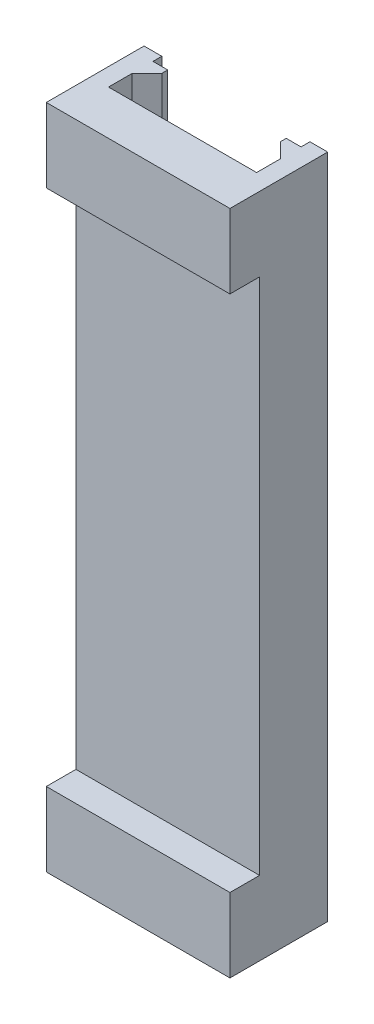
ISO-10303-21;
HEADER;
FILE_DESCRIPTION(('STEP AP214'),'2;1');
FILE_NAME('part.step','',(''),(''),'','','');
FILE_SCHEMA(('AUTOMOTIVE_DESIGN { 1 0 10303 214 1 1 1 1 }'));
ENDSEC;
DATA;
#1=APPLICATION_CONTEXT('core data for automotive mechanical design processes');
#2=APPLICATION_PROTOCOL_DEFINITION('international standard','automotive_design',2000,#1);
#3=PRODUCT_CONTEXT('',#1,'mechanical');
#4=PRODUCT('Part','Part','',(#3));
#5=PRODUCT_RELATED_PRODUCT_CATEGORY('part','',(#4));
#6=PRODUCT_DEFINITION_FORMATION('','',#4);
#7=PRODUCT_DEFINITION_CONTEXT('part definition',#1,'design');
#8=PRODUCT_DEFINITION('design','',#6,#7);
#9=PRODUCT_DEFINITION_SHAPE('','',#8);
#10=(LENGTH_UNIT() NAMED_UNIT(*) SI_UNIT(.MILLI.,.METRE.));
#11=(NAMED_UNIT(*) PLANE_ANGLE_UNIT() SI_UNIT($,.RADIAN.));
#12=(NAMED_UNIT(*) SI_UNIT($,.STERADIAN.) SOLID_ANGLE_UNIT());
#13=UNCERTAINTY_MEASURE_WITH_UNIT(LENGTH_MEASURE(1.E-05),#10,'distance_accuracy_value','');
#14=(GEOMETRIC_REPRESENTATION_CONTEXT(3) GLOBAL_UNCERTAINTY_ASSIGNED_CONTEXT((#13)) GLOBAL_UNIT_ASSIGNED_CONTEXT((#10,
#11,#12)) REPRESENTATION_CONTEXT('',''));
#15=CARTESIAN_POINT('',(0.,0.,0.));
#16=DIRECTION('',(0.,0.,1.));
#17=DIRECTION('',(1.,0.,0.));
#18=AXIS2_PLACEMENT_3D('',#15,#16,#17);
#19=CARTESIAN_POINT('',(-6.2,45.,1.));
#20=DIRECTION('',(0.,0.,-1.));
#21=DIRECTION('',(-1.,0.,0.));
#22=AXIS2_PLACEMENT_3D('',#19,#20,#21);
#23=PLANE('',#22);
#24=DIRECTION('',(-1.,0.,0.));
#25=VECTOR('',#24,1.);
#26=CARTESIAN_POINT('',(-6.2,5.,1.));
#27=LINE('',#26,#25);
#28=CARTESIAN_POINT('',(6.20000000000001,5.00000000000001,1.));
#29=VERTEX_POINT('',#28);
#30=CARTESIAN_POINT('',(-6.2,5.00000000000001,1.));
#31=VERTEX_POINT('',#30);
#32=EDGE_CURVE('E56',#29,#31,#27,.T.);
#33=ORIENTED_EDGE('',*,*,#32,.F.);
#34=DIRECTION('',(0.,-1.,0.));
#35=VECTOR('',#34,1.);
#36=CARTESIAN_POINT('',(6.20000000000001,45.,1.));
#37=LINE('',#36,#35);
#38=CARTESIAN_POINT('',(6.20000000000001,40.,1.));
#39=VERTEX_POINT('',#38);
#40=EDGE_CURVE('E306',#39,#29,#37,.T.);
#41=ORIENTED_EDGE('',*,*,#40,.F.);
#42=DIRECTION('',(1.,0.,0.));
#43=VECTOR('',#42,1.);
#44=CARTESIAN_POINT('',(-6.2,40.,1.));
#45=LINE('',#44,#43);
#46=CARTESIAN_POINT('',(-6.2,40.,1.));
#47=VERTEX_POINT('',#46);
#48=EDGE_CURVE('E197',#47,#39,#45,.T.);
#49=ORIENTED_EDGE('',*,*,#48,.F.);
#50=DIRECTION('',(0.,-1.,0.));
#51=VECTOR('',#50,1.);
#52=CARTESIAN_POINT('',(-6.2,45.,1.));
#53=LINE('',#52,#51);
#54=EDGE_CURVE('E52',#47,#31,#53,.T.);
#55=ORIENTED_EDGE('',*,*,#54,.T.);
#56=EDGE_LOOP('',(#33,#41,#49,#55));
#57=FACE_BOUND('',#56,.T.);
#58=ADVANCED_FACE('F37',(#57),#23,.F.);
#59=CARTESIAN_POINT('',(-5.,45.,0.));
#60=DIRECTION('',(-1.,0.,0.));
#61=DIRECTION('',(0.,0.,1.));
#62=AXIS2_PLACEMENT_3D('',#59,#60,#61);
#63=PLANE('',#62);
#64=DIRECTION('',(0.,0.,-1.));
#65=VECTOR('',#64,1.);
#66=CARTESIAN_POINT('',(-5.,0.,0.));
#67=LINE('',#66,#65);
#68=CARTESIAN_POINT('',(-5.,0.,0.));
#69=VERTEX_POINT('',#68);
#70=CARTESIAN_POINT('',(-5.,0.,-1.6));
#71=VERTEX_POINT('',#70);
#72=EDGE_CURVE('E221',#69,#71,#67,.T.);
#73=ORIENTED_EDGE('',*,*,#72,.T.);
#74=DIRECTION('',(0.,-1.,0.));
#75=VECTOR('',#74,1.);
#76=CARTESIAN_POINT('',(-5.,45.,-1.6));
#77=LINE('',#76,#75);
#78=CARTESIAN_POINT('',(-5.,45.,-1.6));
#79=VERTEX_POINT('',#78);
#80=EDGE_CURVE('E11',#79,#71,#77,.T.);
#81=ORIENTED_EDGE('',*,*,#80,.F.);
#82=DIRECTION('',(0.,0.,-1.));
#83=VECTOR('',#82,1.);
#84=CARTESIAN_POINT('',(-5.,45.,0.));
#85=LINE('',#84,#83);
#86=CARTESIAN_POINT('',(-5.,45.,0.));
#87=VERTEX_POINT('',#86);
#88=EDGE_CURVE('E222',#87,#79,#85,.T.);
#89=ORIENTED_EDGE('',*,*,#88,.F.);
#90=DIRECTION('',(0.,-1.,0.));
#91=VECTOR('',#90,1.);
#92=CARTESIAN_POINT('',(-5.,45.,0.));
#93=LINE('',#92,#91);
#94=EDGE_CURVE('E254',#87,#69,#93,.T.);
#95=ORIENTED_EDGE('',*,*,#94,.T.);
#96=EDGE_LOOP('',(#73,#81,#89,#95));
#97=FACE_BOUND('',#96,.T.);
#98=ADVANCED_FACE('F39',(#97),#63,.F.);
#99=CARTESIAN_POINT('',(-5.,45.,-1.6));
#100=DIRECTION('',(-0.707106781186547,0.,-0.707106781186547));
#101=DIRECTION('',(-0.707106781186548,0.,0.707106781186547));
#102=AXIS2_PLACEMENT_3D('',#99,#100,#101);
#103=PLANE('',#102);
#104=DIRECTION('',(0.707106781186548,0.,-0.707106781186548));
#105=VECTOR('',#104,1.);
#106=CARTESIAN_POINT('',(-5.,0.,-1.6));
#107=LINE('',#106,#105);
#108=CARTESIAN_POINT('',(-4.,0.,-2.6));
#109=VERTEX_POINT('',#108);
#110=EDGE_CURVE('E257',#71,#109,#107,.T.);
#111=ORIENTED_EDGE('',*,*,#110,.T.);
#112=DIRECTION('',(0.,-1.,0.));
#113=VECTOR('',#112,1.);
#114=CARTESIAN_POINT('',(-4.,45.,-2.6));
#115=LINE('',#114,#113);
#116=CARTESIAN_POINT('',(-4.,45.,-2.6));
#117=VERTEX_POINT('',#116);
#118=EDGE_CURVE('E45',#117,#109,#115,.T.);
#119=ORIENTED_EDGE('',*,*,#118,.F.);
#120=DIRECTION('',(0.707106781186548,0.,-0.707106781186548));
#121=VECTOR('',#120,1.);
#122=CARTESIAN_POINT('',(-5.,45.,-1.6));
#123=LINE('',#122,#121);
#124=EDGE_CURVE('E225',#79,#117,#123,.T.);
#125=ORIENTED_EDGE('',*,*,#124,.F.);
#126=ORIENTED_EDGE('',*,*,#80,.T.);
#127=EDGE_LOOP('',(#111,#119,#125,#126));
#128=FACE_BOUND('',#127,.T.);
#129=ADVANCED_FACE('F347',(#128),#103,.F.);
#130=CARTESIAN_POINT('',(-4.,45.,-2.6));
#131=DIRECTION('',(-1.,0.,0.));
#132=DIRECTION('',(0.,0.,1.));
#133=AXIS2_PLACEMENT_3D('',#130,#131,#132);
#134=PLANE('',#133);
#135=DIRECTION('',(0.,0.,-1.));
#136=VECTOR('',#135,1.);
#137=CARTESIAN_POINT('',(-4.,0.,-2.6));
#138=LINE('',#137,#136);
#139=CARTESIAN_POINT('',(-4.,0.,-3.));
#140=VERTEX_POINT('',#139);
#141=EDGE_CURVE('E259',#109,#140,#138,.T.);
#142=ORIENTED_EDGE('',*,*,#141,.T.);
#143=DIRECTION('',(0.,-1.,0.));
#144=VECTOR('',#143,1.);
#145=CARTESIAN_POINT('',(-4.,45.,-3.));
#146=LINE('',#145,#144);
#147=CARTESIAN_POINT('',(-4.,45.,-3.));
#148=VERTEX_POINT('',#147);
#149=EDGE_CURVE('E317',#148,#140,#146,.T.);
#150=ORIENTED_EDGE('',*,*,#149,.F.);
#151=DIRECTION('',(0.,0.,-1.));
#152=VECTOR('',#151,1.);
#153=CARTESIAN_POINT('',(-4.,45.,-2.6));
#154=LINE('',#153,#152);
#155=EDGE_CURVE('E228',#117,#148,#154,.T.);
#156=ORIENTED_EDGE('',*,*,#155,.F.);
#157=ORIENTED_EDGE('',*,*,#118,.T.);
#158=EDGE_LOOP('',(#142,#150,#156,#157));
#159=FACE_BOUND('',#158,.T.);
#160=ADVANCED_FACE('F324',(#159),#134,.F.);
#161=CARTESIAN_POINT('',(-4.,45.,-3.));
#162=DIRECTION('',(0.,0.,1.));
#163=DIRECTION('',(1.,0.,0.));
#164=AXIS2_PLACEMENT_3D('',#161,#162,#163);
#165=PLANE('',#164);
#166=DIRECTION('',(-1.,0.,0.));
#167=VECTOR('',#166,1.);
#168=CARTESIAN_POINT('',(-4.,0.,-3.));
#169=LINE('',#168,#167);
#170=CARTESIAN_POINT('',(-5.,0.,-3.));
#171=VERTEX_POINT('',#170);
#172=EDGE_CURVE('E261',#140,#171,#169,.T.);
#173=ORIENTED_EDGE('',*,*,#172,.T.);
#174=DIRECTION('',(0.,-1.,0.));
#175=VECTOR('',#174,1.);
#176=CARTESIAN_POINT('',(-5.,45.,-3.));
#177=LINE('',#176,#175);
#178=CARTESIAN_POINT('',(-5.,45.,-3.));
#179=VERTEX_POINT('',#178);
#180=EDGE_CURVE('E314',#179,#171,#177,.T.);
#181=ORIENTED_EDGE('',*,*,#180,.F.);
#182=DIRECTION('',(-1.,0.,0.));
#183=VECTOR('',#182,1.);
#184=CARTESIAN_POINT('',(-4.,45.,-3.));
#185=LINE('',#184,#183);
#186=EDGE_CURVE('E230',#148,#179,#185,.T.);
#187=ORIENTED_EDGE('',*,*,#186,.F.);
#188=ORIENTED_EDGE('',*,*,#149,.T.);
#189=EDGE_LOOP('',(#173,#181,#187,#188));
#190=FACE_BOUND('',#189,.T.);
#191=ADVANCED_FACE('F335',(#190),#165,.F.);
#192=CARTESIAN_POINT('',(-5.,45.,-3.));
#193=DIRECTION('',(-1.,0.,0.));
#194=DIRECTION('',(0.,0.,1.));
#195=AXIS2_PLACEMENT_3D('',#192,#193,#194);
#196=PLANE('',#195);
#197=DIRECTION('',(0.,0.,-1.));
#198=VECTOR('',#197,1.);
#199=CARTESIAN_POINT('',(-5.,0.,-3.));
#200=LINE('',#199,#198);
#201=CARTESIAN_POINT('',(-5.,0.,-3.6));
#202=VERTEX_POINT('',#201);
#203=EDGE_CURVE('E263',#171,#202,#200,.T.);
#204=ORIENTED_EDGE('',*,*,#203,.T.);
#205=DIRECTION('',(0.,-1.,0.));
#206=VECTOR('',#205,1.);
#207=CARTESIAN_POINT('',(-5.,45.,-3.6));
#208=LINE('',#207,#206);
#209=CARTESIAN_POINT('',(-5.,45.,-3.6));
#210=VERTEX_POINT('',#209);
#211=EDGE_CURVE('E311',#210,#202,#208,.T.);
#212=ORIENTED_EDGE('',*,*,#211,.F.);
#213=DIRECTION('',(0.,0.,-1.));
#214=VECTOR('',#213,1.);
#215=CARTESIAN_POINT('',(-5.,45.,-3.));
#216=LINE('',#215,#214);
#217=EDGE_CURVE('E232',#179,#210,#216,.T.);
#218=ORIENTED_EDGE('',*,*,#217,.F.);
#219=ORIENTED_EDGE('',*,*,#180,.T.);
#220=EDGE_LOOP('',(#204,#212,#218,#219));
#221=FACE_BOUND('',#220,.T.);
#222=ADVANCED_FACE('F339',(#221),#196,.F.);
#223=CARTESIAN_POINT('',(-5.,45.,-3.6));
#224=DIRECTION('',(0.,0.,1.));
#225=DIRECTION('',(1.,0.,0.));
#226=AXIS2_PLACEMENT_3D('',#223,#224,#225);
#227=PLANE('',#226);
#228=DIRECTION('',(-1.,0.,0.));
#229=VECTOR('',#228,1.);
#230=CARTESIAN_POINT('',(-5.,0.,-3.6));
#231=LINE('',#230,#229);
#232=CARTESIAN_POINT('',(-6.2,0.,-3.6));
#233=VERTEX_POINT('',#232);
#234=EDGE_CURVE('E265',#202,#233,#231,.T.);
#235=ORIENTED_EDGE('',*,*,#234,.T.);
#236=DIRECTION('',(0.,-1.,0.));
#237=VECTOR('',#236,1.);
#238=CARTESIAN_POINT('',(-6.2,45.,-3.6));
#239=LINE('',#238,#237);
#240=CARTESIAN_POINT('',(-6.2,45.,-3.6));
#241=VERTEX_POINT('',#240);
#242=EDGE_CURVE('E309',#241,#233,#239,.T.);
#243=ORIENTED_EDGE('',*,*,#242,.F.);
#244=DIRECTION('',(-1.,0.,0.));
#245=VECTOR('',#244,1.);
#246=CARTESIAN_POINT('',(-5.,45.,-3.6));
#247=LINE('',#246,#245);
#248=EDGE_CURVE('E234',#210,#241,#247,.T.);
#249=ORIENTED_EDGE('',*,*,#248,.F.);
#250=ORIENTED_EDGE('',*,*,#211,.T.);
#251=EDGE_LOOP('',(#235,#243,#249,#250));
#252=FACE_BOUND('',#251,.T.);
#253=ADVANCED_FACE('F417',(#252),#227,.F.);
#254=CARTESIAN_POINT('',(-6.2,45.,-3.6));
#255=DIRECTION('',(1.,0.,0.));
#256=DIRECTION('',(0.,0.,-1.));
#257=AXIS2_PLACEMENT_3D('',#254,#255,#256);
#258=PLANE('',#257);
#259=DIRECTION('',(0.,0.,1.));
#260=VECTOR('',#259,1.);
#261=CARTESIAN_POINT('',(-6.2,0.,-3.6));
#262=LINE('',#261,#260);
#263=CARTESIAN_POINT('',(-6.2,0.,3.));
#264=VERTEX_POINT('',#263);
#265=EDGE_CURVE('E193',#233,#264,#262,.T.);
#266=ORIENTED_EDGE('',*,*,#265,.T.);
#267=DIRECTION('',(0.,-1.,0.));
#268=VECTOR('',#267,1.);
#269=CARTESIAN_POINT('',(-6.2,0.,3.));
#270=LINE('',#269,#268);
#271=CARTESIAN_POINT('',(-6.2,5.,3.));
#272=VERTEX_POINT('',#271);
#273=EDGE_CURVE('E177',#272,#264,#270,.T.);
#274=ORIENTED_EDGE('',*,*,#273,.F.);
#275=DIRECTION('',(0.,0.,-1.));
#276=VECTOR('',#275,1.);
#277=CARTESIAN_POINT('',(-6.2,5.,3.));
#278=LINE('',#277,#276);
#279=EDGE_CURVE('E183',#272,#31,#278,.T.);
#280=ORIENTED_EDGE('',*,*,#279,.T.);
#281=ORIENTED_EDGE('',*,*,#54,.F.);
#282=DIRECTION('',(0.,0.,-1.));
#283=VECTOR('',#282,1.);
#284=CARTESIAN_POINT('',(-6.2,40.,3.));
#285=LINE('',#284,#283);
#286=CARTESIAN_POINT('',(-6.2,40.,3.));
#287=VERTEX_POINT('',#286);
#288=EDGE_CURVE('E218',#287,#47,#285,.T.);
#289=ORIENTED_EDGE('',*,*,#288,.F.);
#290=DIRECTION('',(0.,-1.,0.));
#291=VECTOR('',#290,1.);
#292=CARTESIAN_POINT('',(-6.2,45.,3.));
#293=LINE('',#292,#291);
#294=CARTESIAN_POINT('',(-6.2,45.,3.));
#295=VERTEX_POINT('',#294);
#296=EDGE_CURVE('E202',#295,#287,#293,.T.);
#297=ORIENTED_EDGE('',*,*,#296,.F.);
#298=DIRECTION('',(0.,0.,1.));
#299=VECTOR('',#298,1.);
#300=CARTESIAN_POINT('',(-6.2,45.,-3.6));
#301=LINE('',#300,#299);
#302=EDGE_CURVE('E236',#241,#295,#301,.T.);
#303=ORIENTED_EDGE('',*,*,#302,.F.);
#304=ORIENTED_EDGE('',*,*,#242,.T.);
#305=EDGE_LOOP('',(#266,#274,#280,#281,#289,#297,#303,#304));
#306=FACE_BOUND('',#305,.T.);
#307=ADVANCED_FACE('F190',(#306),#258,.F.);
#308=CARTESIAN_POINT('',(6.2,45.,-3.6));
#309=DIRECTION('',(-1.,0.,0.));
#310=DIRECTION('',(0.,0.,1.));
#311=AXIS2_PLACEMENT_3D('',#308,#309,#310);
#312=PLANE('',#311);
#313=DIRECTION('',(0.,0.,-1.));
#314=VECTOR('',#313,1.);
#315=CARTESIAN_POINT('',(6.2,0.,-3.6));
#316=LINE('',#315,#314);
#317=CARTESIAN_POINT('',(6.20000000000001,0.,3.));
#318=VERTEX_POINT('',#317);
#319=CARTESIAN_POINT('',(6.2,0.,-3.6));
#320=VERTEX_POINT('',#319);
#321=EDGE_CURVE('E268',#318,#320,#316,.T.);
#322=ORIENTED_EDGE('',*,*,#321,.T.);
#323=DIRECTION('',(0.,-1.,0.));
#324=VECTOR('',#323,1.);
#325=CARTESIAN_POINT('',(6.2,45.,-3.6));
#326=LINE('',#325,#324);
#327=CARTESIAN_POINT('',(6.2,45.,-3.6));
#328=VERTEX_POINT('',#327);
#329=EDGE_CURVE('E303',#328,#320,#326,.T.);
#330=ORIENTED_EDGE('',*,*,#329,.F.);
#331=DIRECTION('',(0.,0.,-1.));
#332=VECTOR('',#331,1.);
#333=CARTESIAN_POINT('',(6.2,45.,-3.6));
#334=LINE('',#333,#332);
#335=CARTESIAN_POINT('',(6.20000000000001,45.,3.));
#336=VERTEX_POINT('',#335);
#337=EDGE_CURVE('E238',#336,#328,#334,.T.);
#338=ORIENTED_EDGE('',*,*,#337,.F.);
#339=DIRECTION('',(0.,1.,0.));
#340=VECTOR('',#339,1.);
#341=CARTESIAN_POINT('',(6.20000000000001,45.,3.));
#342=LINE('',#341,#340);
#343=CARTESIAN_POINT('',(6.20000000000001,40.,3.));
#344=VERTEX_POINT('',#343);
#345=EDGE_CURVE('E207',#344,#336,#342,.T.);
#346=ORIENTED_EDGE('',*,*,#345,.F.);
#347=DIRECTION('',(0.,0.,-1.));
#348=VECTOR('',#347,1.);
#349=CARTESIAN_POINT('',(6.20000000000001,40.,3.));
#350=LINE('',#349,#348);
#351=EDGE_CURVE('E213',#344,#39,#350,.T.);
#352=ORIENTED_EDGE('',*,*,#351,.T.);
#353=ORIENTED_EDGE('',*,*,#40,.T.);
#354=DIRECTION('',(0.,0.,-1.));
#355=VECTOR('',#354,1.);
#356=CARTESIAN_POINT('',(6.20000000000001,5.,3.));
#357=LINE('',#356,#355);
#358=CARTESIAN_POINT('',(6.20000000000001,5.,3.));
#359=VERTEX_POINT('',#358);
#360=EDGE_CURVE('E188',#359,#29,#357,.T.);
#361=ORIENTED_EDGE('',*,*,#360,.F.);
#362=DIRECTION('',(0.,1.,0.));
#363=VECTOR('',#362,1.);
#364=CARTESIAN_POINT('',(6.20000000000001,0.,3.));
#365=LINE('',#364,#363);
#366=EDGE_CURVE('E179',#318,#359,#365,.T.);
#367=ORIENTED_EDGE('',*,*,#366,.F.);
#368=EDGE_LOOP('',(#322,#330,#338,#346,#352,#353,#361,#367));
#369=FACE_BOUND('',#368,.T.);
#370=ADVANCED_FACE('F386',(#369),#312,.F.);
#371=CARTESIAN_POINT('',(5.,45.,-3.6));
#372=DIRECTION('',(0.,0.,1.));
#373=DIRECTION('',(1.,0.,0.));
#374=AXIS2_PLACEMENT_3D('',#371,#372,#373);
#375=PLANE('',#374);
#376=DIRECTION('',(-1.,0.,0.));
#377=VECTOR('',#376,1.);
#378=CARTESIAN_POINT('',(5.,0.,-3.6));
#379=LINE('',#378,#377);
#380=CARTESIAN_POINT('',(5.,0.,-3.6));
#381=VERTEX_POINT('',#380);
#382=EDGE_CURVE('E270',#320,#381,#379,.T.);
#383=ORIENTED_EDGE('',*,*,#382,.T.);
#384=DIRECTION('',(0.,-1.,0.));
#385=VECTOR('',#384,1.);
#386=CARTESIAN_POINT('',(5.,45.,-3.6));
#387=LINE('',#386,#385);
#388=CARTESIAN_POINT('',(5.,45.,-3.6));
#389=VERTEX_POINT('',#388);
#390=EDGE_CURVE('E300',#389,#381,#387,.T.);
#391=ORIENTED_EDGE('',*,*,#390,.F.);
#392=DIRECTION('',(-1.,0.,0.));
#393=VECTOR('',#392,1.);
#394=CARTESIAN_POINT('',(5.,45.,-3.6));
#395=LINE('',#394,#393);
#396=EDGE_CURVE('E240',#328,#389,#395,.T.);
#397=ORIENTED_EDGE('',*,*,#396,.F.);
#398=ORIENTED_EDGE('',*,*,#329,.T.);
#399=EDGE_LOOP('',(#383,#391,#397,#398));
#400=FACE_BOUND('',#399,.T.);
#401=ADVANCED_FACE('F382',(#400),#375,.F.);
#402=CARTESIAN_POINT('',(5.,45.,-3.));
#403=DIRECTION('',(1.,0.,0.));
#404=DIRECTION('',(0.,0.,-1.));
#405=AXIS2_PLACEMENT_3D('',#402,#403,#404);
#406=PLANE('',#405);
#407=DIRECTION('',(0.,0.,1.));
#408=VECTOR('',#407,1.);
#409=CARTESIAN_POINT('',(5.,0.,-3.));
#410=LINE('',#409,#408);
#411=CARTESIAN_POINT('',(5.,0.,-3.));
#412=VERTEX_POINT('',#411);
#413=EDGE_CURVE('E272',#381,#412,#410,.T.);
#414=ORIENTED_EDGE('',*,*,#413,.T.);
#415=DIRECTION('',(0.,-1.,0.));
#416=VECTOR('',#415,1.);
#417=CARTESIAN_POINT('',(5.,45.,-3.));
#418=LINE('',#417,#416);
#419=CARTESIAN_POINT('',(5.,45.,-3.));
#420=VERTEX_POINT('',#419);
#421=EDGE_CURVE('E297',#420,#412,#418,.T.);
#422=ORIENTED_EDGE('',*,*,#421,.F.);
#423=DIRECTION('',(0.,0.,1.));
#424=VECTOR('',#423,1.);
#425=CARTESIAN_POINT('',(5.,45.,-3.));
#426=LINE('',#425,#424);
#427=EDGE_CURVE('E242',#389,#420,#426,.T.);
#428=ORIENTED_EDGE('',*,*,#427,.F.);
#429=ORIENTED_EDGE('',*,*,#390,.T.);
#430=EDGE_LOOP('',(#414,#422,#428,#429));
#431=FACE_BOUND('',#430,.T.);
#432=ADVANCED_FACE('F378',(#431),#406,.F.);
#433=CARTESIAN_POINT('',(4.,45.,-3.));
#434=DIRECTION('',(0.,0.,1.));
#435=DIRECTION('',(1.,0.,0.));
#436=AXIS2_PLACEMENT_3D('',#433,#434,#435);
#437=PLANE('',#436);
#438=DIRECTION('',(-1.,0.,0.));
#439=VECTOR('',#438,1.);
#440=CARTESIAN_POINT('',(4.,0.,-3.));
#441=LINE('',#440,#439);
#442=CARTESIAN_POINT('',(4.,0.,-3.));
#443=VERTEX_POINT('',#442);
#444=EDGE_CURVE('E274',#412,#443,#441,.T.);
#445=ORIENTED_EDGE('',*,*,#444,.T.);
#446=DIRECTION('',(0.,-1.,0.));
#447=VECTOR('',#446,1.);
#448=CARTESIAN_POINT('',(4.,45.,-3.));
#449=LINE('',#448,#447);
#450=CARTESIAN_POINT('',(4.,45.,-3.));
#451=VERTEX_POINT('',#450);
#452=EDGE_CURVE('E294',#451,#443,#449,.T.);
#453=ORIENTED_EDGE('',*,*,#452,.F.);
#454=DIRECTION('',(-1.,0.,0.));
#455=VECTOR('',#454,1.);
#456=CARTESIAN_POINT('',(4.,45.,-3.));
#457=LINE('',#456,#455);
#458=EDGE_CURVE('E244',#420,#451,#457,.T.);
#459=ORIENTED_EDGE('',*,*,#458,.F.);
#460=ORIENTED_EDGE('',*,*,#421,.T.);
#461=EDGE_LOOP('',(#445,#453,#459,#460));
#462=FACE_BOUND('',#461,.T.);
#463=ADVANCED_FACE('F374',(#462),#437,.F.);
#464=CARTESIAN_POINT('',(4.,45.,-2.6));
#465=DIRECTION('',(1.,0.,0.));
#466=DIRECTION('',(0.,0.,-1.));
#467=AXIS2_PLACEMENT_3D('',#464,#465,#466);
#468=PLANE('',#467);
#469=DIRECTION('',(0.,0.,1.));
#470=VECTOR('',#469,1.);
#471=CARTESIAN_POINT('',(4.,0.,-2.6));
#472=LINE('',#471,#470);
#473=CARTESIAN_POINT('',(4.,0.,-2.6));
#474=VERTEX_POINT('',#473);
#475=EDGE_CURVE('E276',#443,#474,#472,.T.);
#476=ORIENTED_EDGE('',*,*,#475,.T.);
#477=DIRECTION('',(0.,-1.,0.));
#478=VECTOR('',#477,1.);
#479=CARTESIAN_POINT('',(4.,45.,-2.6));
#480=LINE('',#479,#478);
#481=CARTESIAN_POINT('',(4.,45.,-2.6));
#482=VERTEX_POINT('',#481);
#483=EDGE_CURVE('E291',#482,#474,#480,.T.);
#484=ORIENTED_EDGE('',*,*,#483,.F.);
#485=DIRECTION('',(0.,0.,1.));
#486=VECTOR('',#485,1.);
#487=CARTESIAN_POINT('',(4.,45.,-2.6));
#488=LINE('',#487,#486);
#489=EDGE_CURVE('E246',#451,#482,#488,.T.);
#490=ORIENTED_EDGE('',*,*,#489,.F.);
#491=ORIENTED_EDGE('',*,*,#452,.T.);
#492=EDGE_LOOP('',(#476,#484,#490,#491));
#493=FACE_BOUND('',#492,.T.);
#494=ADVANCED_FACE('F369',(#493),#468,.F.);
#495=CARTESIAN_POINT('',(5.,45.,-1.6));
#496=DIRECTION('',(0.707106781186547,0.,-0.707106781186547));
#497=DIRECTION('',(-0.707106781186548,0.,-0.707106781186547));
#498=AXIS2_PLACEMENT_3D('',#495,#496,#497);
#499=PLANE('',#498);
#500=DIRECTION('',(0.707106781186548,0.,0.707106781186548));
#501=VECTOR('',#500,1.);
#502=CARTESIAN_POINT('',(5.,0.,-1.6));
#503=LINE('',#502,#501);
#504=CARTESIAN_POINT('',(5.,0.,-1.6));
#505=VERTEX_POINT('',#504);
#506=EDGE_CURVE('E278',#474,#505,#503,.T.);
#507=ORIENTED_EDGE('',*,*,#506,.T.);
#508=DIRECTION('',(0.,-1.,0.));
#509=VECTOR('',#508,1.);
#510=CARTESIAN_POINT('',(5.,45.,-1.6));
#511=LINE('',#510,#509);
#512=CARTESIAN_POINT('',(5.,45.,-1.6));
#513=VERTEX_POINT('',#512);
#514=EDGE_CURVE('E288',#513,#505,#511,.T.);
#515=ORIENTED_EDGE('',*,*,#514,.F.);
#516=DIRECTION('',(0.707106781186548,0.,0.707106781186548));
#517=VECTOR('',#516,1.);
#518=CARTESIAN_POINT('',(5.,45.,-1.6));
#519=LINE('',#518,#517);
#520=EDGE_CURVE('E248',#482,#513,#519,.T.);
#521=ORIENTED_EDGE('',*,*,#520,.F.);
#522=ORIENTED_EDGE('',*,*,#483,.T.);
#523=EDGE_LOOP('',(#507,#515,#521,#522));
#524=FACE_BOUND('',#523,.T.);
#525=ADVANCED_FACE('F363',(#524),#499,.F.);
#526=CARTESIAN_POINT('',(5.,45.,0.));
#527=DIRECTION('',(1.,0.,0.));
#528=DIRECTION('',(0.,0.,-1.));
#529=AXIS2_PLACEMENT_3D('',#526,#527,#528);
#530=PLANE('',#529);
#531=DIRECTION('',(0.,0.,1.));
#532=VECTOR('',#531,1.);
#533=CARTESIAN_POINT('',(5.,0.,0.));
#534=LINE('',#533,#532);
#535=CARTESIAN_POINT('',(5.,0.,0.));
#536=VERTEX_POINT('',#535);
#537=EDGE_CURVE('E280',#505,#536,#534,.T.);
#538=ORIENTED_EDGE('',*,*,#537,.T.);
#539=DIRECTION('',(0.,-1.,0.));
#540=VECTOR('',#539,1.);
#541=CARTESIAN_POINT('',(5.,45.,0.));
#542=LINE('',#541,#540);
#543=CARTESIAN_POINT('',(5.,45.,0.));
#544=VERTEX_POINT('',#543);
#545=EDGE_CURVE('E285',#544,#536,#542,.T.);
#546=ORIENTED_EDGE('',*,*,#545,.F.);
#547=DIRECTION('',(0.,0.,1.));
#548=VECTOR('',#547,1.);
#549=CARTESIAN_POINT('',(5.,45.,0.));
#550=LINE('',#549,#548);
#551=EDGE_CURVE('E250',#513,#544,#550,.T.);
#552=ORIENTED_EDGE('',*,*,#551,.F.);
#553=ORIENTED_EDGE('',*,*,#514,.T.);
#554=EDGE_LOOP('',(#538,#546,#552,#553));
#555=FACE_BOUND('',#554,.T.);
#556=ADVANCED_FACE('F359',(#555),#530,.F.);
#557=CARTESIAN_POINT('',(-5.,45.,0.));
#558=DIRECTION('',(0.,0.,1.));
#559=DIRECTION('',(1.,0.,0.));
#560=AXIS2_PLACEMENT_3D('',#557,#558,#559);
#561=PLANE('',#560);
#562=DIRECTION('',(-1.,0.,0.));
#563=VECTOR('',#562,1.);
#564=CARTESIAN_POINT('',(-5.,0.,0.));
#565=LINE('',#564,#563);
#566=EDGE_CURVE('E226',#536,#69,#565,.T.);
#567=ORIENTED_EDGE('',*,*,#566,.T.);
#568=ORIENTED_EDGE('',*,*,#94,.F.);
#569=DIRECTION('',(-1.,0.,0.));
#570=VECTOR('',#569,1.);
#571=CARTESIAN_POINT('',(-5.,45.,0.));
#572=LINE('',#571,#570);
#573=EDGE_CURVE('E252',#544,#87,#572,.T.);
#574=ORIENTED_EDGE('',*,*,#573,.F.);
#575=ORIENTED_EDGE('',*,*,#545,.T.);
#576=EDGE_LOOP('',(#567,#568,#574,#575));
#577=FACE_BOUND('',#576,.T.);
#578=ADVANCED_FACE('F354',(#577),#561,.F.);
#579=CARTESIAN_POINT('',(0.,45.,0.));
#580=DIRECTION('',(0.,1.,0.));
#581=DIRECTION('',(0.,0.,1.));
#582=AXIS2_PLACEMENT_3D('',#579,#580,#581);
#583=PLANE('',#582);
#584=ORIENTED_EDGE('',*,*,#88,.T.);
#585=ORIENTED_EDGE('',*,*,#124,.T.);
#586=ORIENTED_EDGE('',*,*,#155,.T.);
#587=ORIENTED_EDGE('',*,*,#186,.T.);
#588=ORIENTED_EDGE('',*,*,#217,.T.);
#589=ORIENTED_EDGE('',*,*,#248,.T.);
#590=ORIENTED_EDGE('',*,*,#302,.T.);
#591=DIRECTION('',(-1.,0.,0.));
#592=VECTOR('',#591,1.);
#593=CARTESIAN_POINT('',(-6.2,45.,3.));
#594=LINE('',#593,#592);
#595=EDGE_CURVE('E210',#336,#295,#594,.T.);
#596=ORIENTED_EDGE('',*,*,#595,.F.);
#597=ORIENTED_EDGE('',*,*,#337,.T.);
#598=ORIENTED_EDGE('',*,*,#396,.T.);
#599=ORIENTED_EDGE('',*,*,#427,.T.);
#600=ORIENTED_EDGE('',*,*,#458,.T.);
#601=ORIENTED_EDGE('',*,*,#489,.T.);
#602=ORIENTED_EDGE('',*,*,#520,.T.);
#603=ORIENTED_EDGE('',*,*,#551,.T.);
#604=ORIENTED_EDGE('',*,*,#573,.T.);
#605=EDGE_LOOP('',(#584,#585,#586,#587,#588,#589,#590,#596,#597,#598,#599,#600,#601,#602,#603,#604));
#606=FACE_BOUND('',#605,.T.);
#607=ADVANCED_FACE('F343',(#606),#583,.T.);
#608=CARTESIAN_POINT('',(0.,0.,0.));
#609=DIRECTION('',(0.,1.,0.));
#610=DIRECTION('',(0.,0.,1.));
#611=AXIS2_PLACEMENT_3D('',#608,#609,#610);
#612=PLANE('',#611);
#613=ORIENTED_EDGE('',*,*,#72,.F.);
#614=ORIENTED_EDGE('',*,*,#566,.F.);
#615=ORIENTED_EDGE('',*,*,#537,.F.);
#616=ORIENTED_EDGE('',*,*,#506,.F.);
#617=ORIENTED_EDGE('',*,*,#475,.F.);
#618=ORIENTED_EDGE('',*,*,#444,.F.);
#619=ORIENTED_EDGE('',*,*,#413,.F.);
#620=ORIENTED_EDGE('',*,*,#382,.F.);
#621=ORIENTED_EDGE('',*,*,#321,.F.);
#622=DIRECTION('',(1.,0.,0.));
#623=VECTOR('',#622,1.);
#624=CARTESIAN_POINT('',(-6.2,0.,3.));
#625=LINE('',#624,#623);
#626=EDGE_CURVE('E195',#264,#318,#625,.T.);
#627=ORIENTED_EDGE('',*,*,#626,.F.);
#628=ORIENTED_EDGE('',*,*,#265,.F.);
#629=ORIENTED_EDGE('',*,*,#234,.F.);
#630=ORIENTED_EDGE('',*,*,#203,.F.);
#631=ORIENTED_EDGE('',*,*,#172,.F.);
#632=ORIENTED_EDGE('',*,*,#141,.F.);
#633=ORIENTED_EDGE('',*,*,#110,.F.);
#634=EDGE_LOOP('',(#613,#614,#615,#616,#617,#618,#619,#620,#621,#627,#628,#629,#630,#631,#632,#633));
#635=FACE_BOUND('',#634,.T.);
#636=ADVANCED_FACE('F330',(#635),#612,.F.);
#637=CARTESIAN_POINT('',(-6.2,40.,3.));
#638=DIRECTION('',(0.,1.,0.));
#639=DIRECTION('',(0.,0.,1.));
#640=AXIS2_PLACEMENT_3D('',#637,#638,#639);
#641=PLANE('',#640);
#642=ORIENTED_EDGE('',*,*,#48,.T.);
#643=ORIENTED_EDGE('',*,*,#351,.F.);
#644=DIRECTION('',(1.,0.,0.));
#645=VECTOR('',#644,1.);
#646=CARTESIAN_POINT('',(-6.2,40.,3.));
#647=LINE('',#646,#645);
#648=EDGE_CURVE('E205',#287,#344,#647,.T.);
#649=ORIENTED_EDGE('',*,*,#648,.F.);
#650=ORIENTED_EDGE('',*,*,#288,.T.);
#651=EDGE_LOOP('',(#642,#643,#649,#650));
#652=FACE_BOUND('',#651,.T.);
#653=ADVANCED_FACE('F391',(#652),#641,.F.);
#654=CARTESIAN_POINT('',(0.,0.,3.));
#655=DIRECTION('',(0.,0.,1.));
#656=DIRECTION('',(1.,0.,0.));
#657=AXIS2_PLACEMENT_3D('',#654,#655,#656);
#658=PLANE('',#657);
#659=ORIENTED_EDGE('',*,*,#296,.T.);
#660=ORIENTED_EDGE('',*,*,#648,.T.);
#661=ORIENTED_EDGE('',*,*,#345,.T.);
#662=ORIENTED_EDGE('',*,*,#595,.T.);
#663=EDGE_LOOP('',(#659,#660,#661,#662));
#664=FACE_BOUND('',#663,.T.);
#665=ADVANCED_FACE('F396',(#664),#658,.T.);
#666=CARTESIAN_POINT('',(-6.2,5.,3.));
#667=DIRECTION('',(0.,-1.,0.));
#668=DIRECTION('',(1.,0.,0.));
#669=AXIS2_PLACEMENT_3D('',#666,#667,#668);
#670=PLANE('',#669);
#671=ORIENTED_EDGE('',*,*,#32,.T.);
#672=ORIENTED_EDGE('',*,*,#279,.F.);
#673=DIRECTION('',(-1.,0.,0.));
#674=VECTOR('',#673,1.);
#675=CARTESIAN_POINT('',(-6.2,5.,3.));
#676=LINE('',#675,#674);
#677=EDGE_CURVE('E172',#359,#272,#676,.T.);
#678=ORIENTED_EDGE('',*,*,#677,.F.);
#679=ORIENTED_EDGE('',*,*,#360,.T.);
#680=EDGE_LOOP('',(#671,#672,#678,#679));
#681=FACE_BOUND('',#680,.T.);
#682=ADVANCED_FACE('F186',(#681),#670,.F.);
#683=CARTESIAN_POINT('',(0.,0.,3.));
#684=DIRECTION('',(0.,0.,-1.));
#685=DIRECTION('',(-1.,0.,0.));
#686=AXIS2_PLACEMENT_3D('',#683,#684,#685);
#687=PLANE('',#686);
#688=ORIENTED_EDGE('',*,*,#273,.T.);
#689=ORIENTED_EDGE('',*,*,#626,.T.);
#690=ORIENTED_EDGE('',*,*,#366,.T.);
#691=ORIENTED_EDGE('',*,*,#677,.T.);
#692=EDGE_LOOP('',(#688,#689,#690,#691));
#693=FACE_BOUND('',#692,.T.);
#694=ADVANCED_FACE('F174',(#693),#687,.F.);
#695=CLOSED_SHELL('',(#58,#98,#129,#160,#191,#222,#253,#307,#370,#401,#432,#463,#494,#525,#556,
#578,#607,#636,#653,#665,#682,#694));
#696=MANIFOLD_SOLID_BREP('B2',#695);
#697=ADVANCED_BREP_SHAPE_REPRESENTATION('',(#18,#696),#14);
#698=SHAPE_DEFINITION_REPRESENTATION(#9,#697);
ENDSEC;
END-ISO-10303-21;
